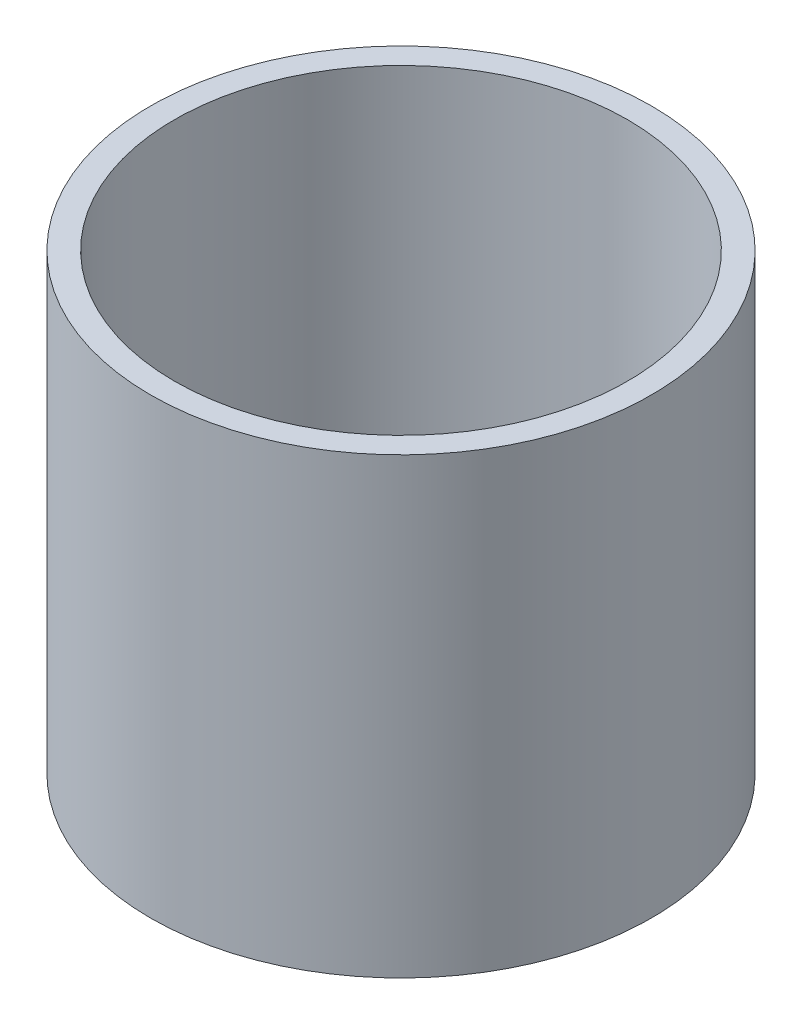
ISO-10303-21;
HEADER;
FILE_DESCRIPTION(('STEP AP214'),'2;1');
FILE_NAME('part.step','',(''),(''),'','','');
FILE_SCHEMA(('AUTOMOTIVE_DESIGN { 1 0 10303 214 1 1 1 1 }'));
ENDSEC;
DATA;
#1=APPLICATION_CONTEXT('core data for automotive mechanical design processes');
#2=APPLICATION_PROTOCOL_DEFINITION('international standard','automotive_design',2000,#1);
#3=PRODUCT_CONTEXT('',#1,'mechanical');
#4=PRODUCT('Part','Part','',(#3));
#5=PRODUCT_RELATED_PRODUCT_CATEGORY('part','',(#4));
#6=PRODUCT_DEFINITION_FORMATION('','',#4);
#7=PRODUCT_DEFINITION_CONTEXT('part definition',#1,'design');
#8=PRODUCT_DEFINITION('design','',#6,#7);
#9=PRODUCT_DEFINITION_SHAPE('','',#8);
#10=(LENGTH_UNIT() NAMED_UNIT(*) SI_UNIT(.MILLI.,.METRE.));
#11=(NAMED_UNIT(*) PLANE_ANGLE_UNIT() SI_UNIT($,.RADIAN.));
#12=(NAMED_UNIT(*) SI_UNIT($,.STERADIAN.) SOLID_ANGLE_UNIT());
#13=UNCERTAINTY_MEASURE_WITH_UNIT(LENGTH_MEASURE(1.E-05),#10,'distance_accuracy_value','');
#14=(GEOMETRIC_REPRESENTATION_CONTEXT(3) GLOBAL_UNCERTAINTY_ASSIGNED_CONTEXT((#13)) GLOBAL_UNIT_ASSIGNED_CONTEXT((#10,
#11,#12)) REPRESENTATION_CONTEXT('',''));
#15=CARTESIAN_POINT('',(0.,0.,0.));
#16=DIRECTION('',(0.,0.,1.));
#17=DIRECTION('',(1.,0.,0.));
#18=AXIS2_PLACEMENT_3D('',#15,#16,#17);
#19=CARTESIAN_POINT('',(0.,190.,0.));
#20=DIRECTION('',(0.,-1.,0.));
#21=DIRECTION('',(0.,0.,-1.));
#22=AXIS2_PLACEMENT_3D('',#19,#20,#21);
#23=CYLINDRICAL_SURFACE('',#22,95.);
#24=CARTESIAN_POINT('',(0.,0.,0.));
#25=DIRECTION('',(0.,-1.,0.));
#26=DIRECTION('',(0.,0.,-1.));
#27=AXIS2_PLACEMENT_3D('',#24,#25,#26);
#28=CIRCLE('',#27,95.);
#29=CARTESIAN_POINT('',(0.,0.,-95.));
#30=VERTEX_POINT('',#29);
#31=EDGE_CURVE('E26',#30,#30,#28,.T.);
#32=ORIENTED_EDGE('',*,*,#31,.T.);
#33=EDGE_LOOP('',(#32));
#34=FACE_BOUND('',#33,.T.);
#35=CARTESIAN_POINT('',(0.,190.,0.));
#36=DIRECTION('',(0.,-1.,0.));
#37=DIRECTION('',(0.,0.,-1.));
#38=AXIS2_PLACEMENT_3D('',#35,#36,#37);
#39=CIRCLE('',#38,95.);
#40=CARTESIAN_POINT('',(0.,190.,-95.));
#41=VERTEX_POINT('',#40);
#42=EDGE_CURVE('E17',#41,#41,#39,.T.);
#43=ORIENTED_EDGE('',*,*,#42,.F.);
#44=EDGE_LOOP('',(#43));
#45=FACE_BOUND('',#44,.T.);
#46=ADVANCED_FACE('F14',(#34,#45),#23,.F.);
#47=CARTESIAN_POINT('',(0.,190.,0.));
#48=DIRECTION('',(0.,1.,0.));
#49=DIRECTION('',(0.,0.,1.));
#50=AXIS2_PLACEMENT_3D('',#47,#48,#49);
#51=PLANE('',#50);
#52=ORIENTED_EDGE('',*,*,#42,.T.);
#53=EDGE_LOOP('',(#52));
#54=FACE_BOUND('',#53,.T.);
#55=CARTESIAN_POINT('',(0.,190.,0.));
#56=DIRECTION('',(0.,-1.,0.));
#57=DIRECTION('',(0.,0.,-1.));
#58=AXIS2_PLACEMENT_3D('',#55,#56,#57);
#59=CIRCLE('',#58,105.);
#60=CARTESIAN_POINT('',(0.,190.,-105.));
#61=VERTEX_POINT('',#60);
#62=EDGE_CURVE('E21',#61,#61,#59,.T.);
#63=ORIENTED_EDGE('',*,*,#62,.F.);
#64=EDGE_LOOP('',(#63));
#65=FACE_BOUND('',#64,.T.);
#66=ADVANCED_FACE('F34',(#54,#65),#51,.T.);
#67=CARTESIAN_POINT('',(0.,0.,0.));
#68=DIRECTION('',(0.,1.,0.));
#69=DIRECTION('',(0.,0.,1.));
#70=AXIS2_PLACEMENT_3D('',#67,#68,#69);
#71=PLANE('',#70);
#72=ORIENTED_EDGE('',*,*,#31,.F.);
#73=EDGE_LOOP('',(#72));
#74=FACE_BOUND('',#73,.T.);
#75=CARTESIAN_POINT('',(0.,0.,0.));
#76=DIRECTION('',(0.,-1.,0.));
#77=DIRECTION('',(0.,0.,-1.));
#78=AXIS2_PLACEMENT_3D('',#75,#76,#77);
#79=CIRCLE('',#78,105.);
#80=CARTESIAN_POINT('',(0.,0.,-105.));
#81=VERTEX_POINT('',#80);
#82=EDGE_CURVE('E10',#81,#81,#79,.F.);
#83=ORIENTED_EDGE('',*,*,#82,.F.);
#84=EDGE_LOOP('',(#83));
#85=FACE_BOUND('',#84,.T.);
#86=ADVANCED_FACE('F43',(#74,#85),#71,.F.);
#87=CARTESIAN_POINT('',(0.,190.,0.));
#88=DIRECTION('',(0.,-1.,0.));
#89=DIRECTION('',(0.,0.,-1.));
#90=AXIS2_PLACEMENT_3D('',#87,#88,#89);
#91=CYLINDRICAL_SURFACE('',#90,105.);
#92=ORIENTED_EDGE('',*,*,#82,.T.);
#93=EDGE_LOOP('',(#92));
#94=FACE_BOUND('',#93,.T.);
#95=ORIENTED_EDGE('',*,*,#62,.T.);
#96=EDGE_LOOP('',(#95));
#97=FACE_BOUND('',#96,.T.);
#98=ADVANCED_FACE('F44',(#94,#97),#91,.T.);
#99=CLOSED_SHELL('',(#46,#66,#86,#98));
#100=MANIFOLD_SOLID_BREP('B1',#99);
#101=ADVANCED_BREP_SHAPE_REPRESENTATION('',(#18,#100),#14);
#102=SHAPE_DEFINITION_REPRESENTATION(#9,#101);
ENDSEC;
END-ISO-10303-21;
